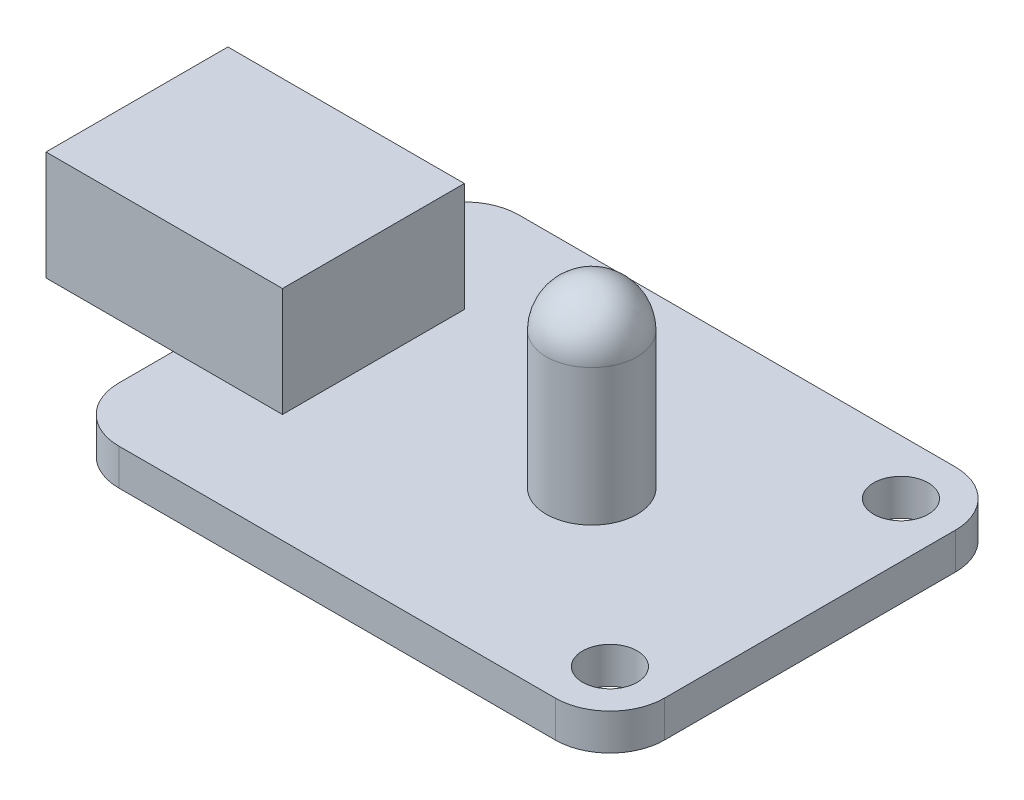
ISO-10303-21;
HEADER;
FILE_DESCRIPTION(('STEP AP214'),'2;1');
FILE_NAME('part.step','',(''),(''),'','','');
FILE_SCHEMA(('AUTOMOTIVE_DESIGN { 1 0 10303 214 1 1 1 1 }'));
ENDSEC;
DATA;
#1=APPLICATION_CONTEXT('core data for automotive mechanical design processes');
#2=APPLICATION_PROTOCOL_DEFINITION('international standard','automotive_design',2000,#1);
#3=PRODUCT_CONTEXT('',#1,'mechanical');
#4=PRODUCT('Part','Part','',(#3));
#5=PRODUCT_RELATED_PRODUCT_CATEGORY('part','',(#4));
#6=PRODUCT_DEFINITION_FORMATION('','',#4);
#7=PRODUCT_DEFINITION_CONTEXT('part definition',#1,'design');
#8=PRODUCT_DEFINITION('design','',#6,#7);
#9=PRODUCT_DEFINITION_SHAPE('','',#8);
#10=(LENGTH_UNIT() NAMED_UNIT(*) SI_UNIT(.MILLI.,.METRE.));
#11=(NAMED_UNIT(*) PLANE_ANGLE_UNIT() SI_UNIT($,.RADIAN.));
#12=(NAMED_UNIT(*) SI_UNIT($,.STERADIAN.) SOLID_ANGLE_UNIT());
#13=UNCERTAINTY_MEASURE_WITH_UNIT(LENGTH_MEASURE(1.E-05),#10,'distance_accuracy_value','');
#14=(GEOMETRIC_REPRESENTATION_CONTEXT(3) GLOBAL_UNCERTAINTY_ASSIGNED_CONTEXT((#13)) GLOBAL_UNIT_ASSIGNED_CONTEXT((#10,
#11,#12)) REPRESENTATION_CONTEXT('',''));
#15=CARTESIAN_POINT('',(0.,0.,0.));
#16=DIRECTION('',(0.,0.,1.));
#17=DIRECTION('',(1.,0.,0.));
#18=AXIS2_PLACEMENT_3D('',#15,#16,#17);
#19=CARTESIAN_POINT('',(12.,2.,-8.));
#20=DIRECTION('',(0.,1.,0.));
#21=DIRECTION('',(0.,0.,1.));
#22=AXIS2_PLACEMENT_3D('',#19,#20,#21);
#23=PLANE('',#22);
#24=CARTESIAN_POINT('',(3.,2.,0.));
#25=DIRECTION('',(0.,1.,0.));
#26=DIRECTION('',(0.,0.,1.));
#27=AXIS2_PLACEMENT_3D('',#24,#25,#26);
#28=CIRCLE('',#27,2.5);
#29=CARTESIAN_POINT('',(3.,2.,2.5));
#30=VERTEX_POINT('',#29);
#31=EDGE_CURVE('E242',#30,#30,#28,.T.);
#32=ORIENTED_EDGE('',*,*,#31,.F.);
#33=EDGE_LOOP('',(#32));
#34=FACE_BOUND('',#33,.T.);
#35=DIRECTION('',(1.,0.,0.));
#36=VECTOR('',#35,1.);
#37=CARTESIAN_POINT('',(-22.,2.,5.));
#38=LINE('',#37,#36);
#39=CARTESIAN_POINT('',(-15.,2.,5.));
#40=VERTEX_POINT('',#39);
#41=CARTESIAN_POINT('',(-9.00000000000001,2.,5.));
#42=VERTEX_POINT('',#41);
#43=EDGE_CURVE('E43',#40,#42,#38,.T.);
#44=ORIENTED_EDGE('',*,*,#43,.F.);
#45=DIRECTION('',(0.,0.,1.));
#46=VECTOR('',#45,1.);
#47=CARTESIAN_POINT('',(-15.,2.,-7.99999999999998));
#48=LINE('',#47,#46);
#49=CARTESIAN_POINT('',(-15.,2.,7.99999999999998));
#50=VERTEX_POINT('',#49);
#51=EDGE_CURVE('E176',#40,#50,#48,.T.);
#52=ORIENTED_EDGE('',*,*,#51,.T.);
#53=CARTESIAN_POINT('',(-12.,2.,8.));
#54=DIRECTION('',(0.,1.,0.));
#55=DIRECTION('',(0.,0.,1.));
#56=AXIS2_PLACEMENT_3D('',#53,#54,#55);
#57=CIRCLE('',#56,3.);
#58=CARTESIAN_POINT('',(-12.,2.,11.));
#59=VERTEX_POINT('',#58);
#60=EDGE_CURVE('E179',#50,#59,#57,.T.);
#61=ORIENTED_EDGE('',*,*,#60,.T.);
#62=DIRECTION('',(1.,0.,0.));
#63=VECTOR('',#62,1.);
#64=CARTESIAN_POINT('',(-12.,2.,11.));
#65=LINE('',#64,#63);
#66=CARTESIAN_POINT('',(12.,2.,11.));
#67=VERTEX_POINT('',#66);
#68=EDGE_CURVE('E182',#59,#67,#65,.T.);
#69=ORIENTED_EDGE('',*,*,#68,.T.);
#70=CARTESIAN_POINT('',(12.,2.,8.));
#71=DIRECTION('',(0.,1.,0.));
#72=DIRECTION('',(0.,0.,-1.));
#73=AXIS2_PLACEMENT_3D('',#70,#71,#72);
#74=CIRCLE('',#73,3.);
#75=CARTESIAN_POINT('',(15.,2.,7.99999999999998));
#76=VERTEX_POINT('',#75);
#77=EDGE_CURVE('E184',#67,#76,#74,.T.);
#78=ORIENTED_EDGE('',*,*,#77,.T.);
#79=DIRECTION('',(0.,0.,-1.));
#80=VECTOR('',#79,1.);
#81=CARTESIAN_POINT('',(15.,2.,-7.99999999999998));
#82=LINE('',#81,#80);
#83=CARTESIAN_POINT('',(15.,2.,-7.99999999999998));
#84=VERTEX_POINT('',#83);
#85=EDGE_CURVE('E186',#76,#84,#82,.T.);
#86=ORIENTED_EDGE('',*,*,#85,.T.);
#87=CARTESIAN_POINT('',(12.,2.,-8.));
#88=DIRECTION('',(0.,1.,0.));
#89=DIRECTION('',(0.,0.,1.));
#90=AXIS2_PLACEMENT_3D('',#87,#88,#89);
#91=CIRCLE('',#90,3.);
#92=CARTESIAN_POINT('',(12.,2.,-11.));
#93=VERTEX_POINT('',#92);
#94=EDGE_CURVE('E168',#84,#93,#91,.T.);
#95=ORIENTED_EDGE('',*,*,#94,.T.);
#96=DIRECTION('',(-1.,0.,0.));
#97=VECTOR('',#96,1.);
#98=CARTESIAN_POINT('',(-12.,2.,-11.));
#99=LINE('',#98,#97);
#100=CARTESIAN_POINT('',(-12.,2.,-11.));
#101=VERTEX_POINT('',#100);
#102=EDGE_CURVE('E171',#93,#101,#99,.T.);
#103=ORIENTED_EDGE('',*,*,#102,.T.);
#104=CARTESIAN_POINT('',(-12.,2.,-8.));
#105=DIRECTION('',(0.,1.,0.));
#106=DIRECTION('',(0.,0.,-1.));
#107=AXIS2_PLACEMENT_3D('',#104,#105,#106);
#108=CIRCLE('',#107,3.);
#109=CARTESIAN_POINT('',(-15.,2.,-7.99999999999998));
#110=VERTEX_POINT('',#109);
#111=EDGE_CURVE('E174',#101,#110,#108,.T.);
#112=ORIENTED_EDGE('',*,*,#111,.T.);
#113=CARTESIAN_POINT('',(-15.,2.,-5.));
#114=VERTEX_POINT('',#113);
#115=EDGE_CURVE('E177',#110,#114,#48,.T.);
#116=ORIENTED_EDGE('',*,*,#115,.T.);
#117=DIRECTION('',(-1.,0.,0.));
#118=VECTOR('',#117,1.);
#119=CARTESIAN_POINT('',(-22.,2.,-5.));
#120=LINE('',#119,#118);
#121=CARTESIAN_POINT('',(-9.00000000000001,2.,-5.));
#122=VERTEX_POINT('',#121);
#123=EDGE_CURVE('E55',#122,#114,#120,.T.);
#124=ORIENTED_EDGE('',*,*,#123,.F.);
#125=DIRECTION('',(0.,0.,-1.));
#126=VECTOR('',#125,1.);
#127=CARTESIAN_POINT('',(-9.00000000000001,2.,-5.));
#128=LINE('',#127,#126);
#129=EDGE_CURVE('E50',#42,#122,#128,.T.);
#130=ORIENTED_EDGE('',*,*,#129,.F.);
#131=EDGE_LOOP('',(#44,#52,#61,#69,#78,#86,#95,#103,#112,#116,#124,#130));
#132=FACE_BOUND('',#131,.T.);
#133=CARTESIAN_POINT('',(12.,2.,-8.));
#134=DIRECTION('',(0.,1.,0.));
#135=DIRECTION('',(0.,0.,1.));
#136=AXIS2_PLACEMENT_3D('',#133,#134,#135);
#137=CIRCLE('',#136,1.5);
#138=CARTESIAN_POINT('',(12.,2.,-6.5));
#139=VERTEX_POINT('',#138);
#140=EDGE_CURVE('E162',#139,#139,#137,.T.);
#141=ORIENTED_EDGE('',*,*,#140,.F.);
#142=EDGE_LOOP('',(#141));
#143=FACE_BOUND('',#142,.T.);
#144=CARTESIAN_POINT('',(12.,2.,8.));
#145=DIRECTION('',(0.,1.,0.));
#146=DIRECTION('',(0.,0.,1.));
#147=AXIS2_PLACEMENT_3D('',#144,#145,#146);
#148=CIRCLE('',#147,1.5);
#149=CARTESIAN_POINT('',(12.,2.,9.5));
#150=VERTEX_POINT('',#149);
#151=EDGE_CURVE('E153',#150,#150,#148,.T.);
#152=ORIENTED_EDGE('',*,*,#151,.F.);
#153=EDGE_LOOP('',(#152));
#154=FACE_BOUND('',#153,.T.);
#155=ADVANCED_FACE('F35',(#34,#132,#143,#154),#23,.T.);
#156=CARTESIAN_POINT('',(12.,0.,-8.));
#157=DIRECTION('',(0.,1.,0.));
#158=DIRECTION('',(0.,0.,1.));
#159=AXIS2_PLACEMENT_3D('',#156,#157,#158);
#160=PLANE('',#159);
#161=CARTESIAN_POINT('',(12.,0.,-8.));
#162=DIRECTION('',(0.,1.,0.));
#163=DIRECTION('',(0.,0.,1.));
#164=AXIS2_PLACEMENT_3D('',#161,#162,#163);
#165=CIRCLE('',#164,3.);
#166=CARTESIAN_POINT('',(15.,0.,-7.99999999999998));
#167=VERTEX_POINT('',#166);
#168=CARTESIAN_POINT('',(12.,0.,-11.));
#169=VERTEX_POINT('',#168);
#170=EDGE_CURVE('E165',#167,#169,#165,.T.);
#171=ORIENTED_EDGE('',*,*,#170,.F.);
#172=DIRECTION('',(0.,0.,-1.));
#173=VECTOR('',#172,1.);
#174=CARTESIAN_POINT('',(15.,0.,-7.99999999999998));
#175=LINE('',#174,#173);
#176=CARTESIAN_POINT('',(15.,0.,7.99999999999998));
#177=VERTEX_POINT('',#176);
#178=EDGE_CURVE('E172',#177,#167,#175,.T.);
#179=ORIENTED_EDGE('',*,*,#178,.F.);
#180=CARTESIAN_POINT('',(12.,0.,8.));
#181=DIRECTION('',(0.,1.,0.));
#182=DIRECTION('',(0.,0.,-1.));
#183=AXIS2_PLACEMENT_3D('',#180,#181,#182);
#184=CIRCLE('',#183,3.);
#185=CARTESIAN_POINT('',(12.,0.,11.));
#186=VERTEX_POINT('',#185);
#187=EDGE_CURVE('E201',#186,#177,#184,.T.);
#188=ORIENTED_EDGE('',*,*,#187,.F.);
#189=DIRECTION('',(1.,0.,0.));
#190=VECTOR('',#189,1.);
#191=CARTESIAN_POINT('',(-12.,0.,11.));
#192=LINE('',#191,#190);
#193=CARTESIAN_POINT('',(-12.,0.,11.));
#194=VERTEX_POINT('',#193);
#195=EDGE_CURVE('E199',#194,#186,#192,.T.);
#196=ORIENTED_EDGE('',*,*,#195,.F.);
#197=CARTESIAN_POINT('',(-12.,0.,8.));
#198=DIRECTION('',(0.,1.,0.));
#199=DIRECTION('',(0.,0.,1.));
#200=AXIS2_PLACEMENT_3D('',#197,#198,#199);
#201=CIRCLE('',#200,3.);
#202=CARTESIAN_POINT('',(-15.,0.,7.99999999999998));
#203=VERTEX_POINT('',#202);
#204=EDGE_CURVE('E197',#203,#194,#201,.T.);
#205=ORIENTED_EDGE('',*,*,#204,.F.);
#206=DIRECTION('',(0.,0.,1.));
#207=VECTOR('',#206,1.);
#208=CARTESIAN_POINT('',(-15.,0.,-7.99999999999998));
#209=LINE('',#208,#207);
#210=CARTESIAN_POINT('',(-15.,0.,-7.99999999999998));
#211=VERTEX_POINT('',#210);
#212=EDGE_CURVE('E195',#211,#203,#209,.T.);
#213=ORIENTED_EDGE('',*,*,#212,.F.);
#214=CARTESIAN_POINT('',(-12.,0.,-8.));
#215=DIRECTION('',(0.,1.,0.));
#216=DIRECTION('',(0.,0.,-1.));
#217=AXIS2_PLACEMENT_3D('',#214,#215,#216);
#218=CIRCLE('',#217,3.);
#219=CARTESIAN_POINT('',(-12.,0.,-11.));
#220=VERTEX_POINT('',#219);
#221=EDGE_CURVE('E193',#220,#211,#218,.T.);
#222=ORIENTED_EDGE('',*,*,#221,.F.);
#223=DIRECTION('',(-1.,0.,0.));
#224=VECTOR('',#223,1.);
#225=CARTESIAN_POINT('',(-12.,0.,-11.));
#226=LINE('',#225,#224);
#227=EDGE_CURVE('E191',#169,#220,#226,.T.);
#228=ORIENTED_EDGE('',*,*,#227,.F.);
#229=EDGE_LOOP('',(#171,#179,#188,#196,#205,#213,#222,#228));
#230=FACE_BOUND('',#229,.T.);
#231=CARTESIAN_POINT('',(12.,0.,-8.));
#232=DIRECTION('',(0.,1.,0.));
#233=DIRECTION('',(0.,0.,1.));
#234=AXIS2_PLACEMENT_3D('',#231,#232,#233);
#235=CIRCLE('',#234,1.5);
#236=CARTESIAN_POINT('',(12.,0.,-6.5));
#237=VERTEX_POINT('',#236);
#238=EDGE_CURVE('E160',#237,#237,#235,.T.);
#239=ORIENTED_EDGE('',*,*,#238,.T.);
#240=EDGE_LOOP('',(#239));
#241=FACE_BOUND('',#240,.T.);
#242=CARTESIAN_POINT('',(12.,0.,8.));
#243=DIRECTION('',(0.,1.,0.));
#244=DIRECTION('',(0.,0.,1.));
#245=AXIS2_PLACEMENT_3D('',#242,#243,#244);
#246=CIRCLE('',#245,1.5);
#247=CARTESIAN_POINT('',(12.,0.,9.5));
#248=VERTEX_POINT('',#247);
#249=EDGE_CURVE('E150',#248,#248,#246,.T.);
#250=ORIENTED_EDGE('',*,*,#249,.T.);
#251=EDGE_LOOP('',(#250));
#252=FACE_BOUND('',#251,.T.);
#253=ADVANCED_FACE('F252',(#230,#241,#252),#160,.F.);
#254=CARTESIAN_POINT('',(12.,2.,-8.));
#255=DIRECTION('',(0.,-1.,0.));
#256=DIRECTION('',(0.,0.,-1.));
#257=AXIS2_PLACEMENT_3D('',#254,#255,#256);
#258=CYLINDRICAL_SURFACE('',#257,3.);
#259=ORIENTED_EDGE('',*,*,#170,.T.);
#260=DIRECTION('',(0.,-1.,0.));
#261=VECTOR('',#260,1.);
#262=CARTESIAN_POINT('',(12.,2.,-11.));
#263=LINE('',#262,#261);
#264=EDGE_CURVE('E223',#93,#169,#263,.T.);
#265=ORIENTED_EDGE('',*,*,#264,.F.);
#266=ORIENTED_EDGE('',*,*,#94,.F.);
#267=DIRECTION('',(0.,-1.,0.));
#268=VECTOR('',#267,1.);
#269=CARTESIAN_POINT('',(15.,2.,-7.99999999999998));
#270=LINE('',#269,#268);
#271=EDGE_CURVE('E188',#84,#167,#270,.T.);
#272=ORIENTED_EDGE('',*,*,#271,.T.);
#273=EDGE_LOOP('',(#259,#265,#266,#272));
#274=FACE_BOUND('',#273,.T.);
#275=ADVANCED_FACE('F269',(#274),#258,.T.);
#276=CARTESIAN_POINT('',(-12.,2.,-11.));
#277=DIRECTION('',(0.,0.,1.));
#278=DIRECTION('',(1.,0.,0.));
#279=AXIS2_PLACEMENT_3D('',#276,#277,#278);
#280=PLANE('',#279);
#281=ORIENTED_EDGE('',*,*,#227,.T.);
#282=DIRECTION('',(0.,-1.,0.));
#283=VECTOR('',#282,1.);
#284=CARTESIAN_POINT('',(-12.,2.,-11.));
#285=LINE('',#284,#283);
#286=EDGE_CURVE('E221',#101,#220,#285,.T.);
#287=ORIENTED_EDGE('',*,*,#286,.F.);
#288=ORIENTED_EDGE('',*,*,#102,.F.);
#289=ORIENTED_EDGE('',*,*,#264,.T.);
#290=EDGE_LOOP('',(#281,#287,#288,#289));
#291=FACE_BOUND('',#290,.T.);
#292=ADVANCED_FACE('F276',(#291),#280,.F.);
#293=CARTESIAN_POINT('',(-12.,2.,-8.));
#294=DIRECTION('',(0.,-1.,0.));
#295=DIRECTION('',(0.,0.,-1.));
#296=AXIS2_PLACEMENT_3D('',#293,#294,#295);
#297=CYLINDRICAL_SURFACE('',#296,3.);
#298=ORIENTED_EDGE('',*,*,#221,.T.);
#299=DIRECTION('',(0.,-1.,0.));
#300=VECTOR('',#299,1.);
#301=CARTESIAN_POINT('',(-15.,2.,-7.99999999999998));
#302=LINE('',#301,#300);
#303=EDGE_CURVE('E218',#110,#211,#302,.T.);
#304=ORIENTED_EDGE('',*,*,#303,.F.);
#305=ORIENTED_EDGE('',*,*,#111,.F.);
#306=ORIENTED_EDGE('',*,*,#286,.T.);
#307=EDGE_LOOP('',(#298,#304,#305,#306));
#308=FACE_BOUND('',#307,.T.);
#309=ADVANCED_FACE('F301',(#308),#297,.T.);
#310=CARTESIAN_POINT('',(-15.,2.,-7.99999999999998));
#311=DIRECTION('',(1.,0.,0.));
#312=DIRECTION('',(0.,0.,-1.));
#313=AXIS2_PLACEMENT_3D('',#310,#311,#312);
#314=PLANE('',#313);
#315=ORIENTED_EDGE('',*,*,#212,.T.);
#316=DIRECTION('',(0.,-1.,0.));
#317=VECTOR('',#316,1.);
#318=CARTESIAN_POINT('',(-15.,2.,7.99999999999998));
#319=LINE('',#318,#317);
#320=EDGE_CURVE('E215',#50,#203,#319,.T.);
#321=ORIENTED_EDGE('',*,*,#320,.F.);
#322=ORIENTED_EDGE('',*,*,#51,.F.);
#323=EDGE_CURVE('E180',#114,#40,#48,.T.);
#324=ORIENTED_EDGE('',*,*,#323,.F.);
#325=ORIENTED_EDGE('',*,*,#115,.F.);
#326=ORIENTED_EDGE('',*,*,#303,.T.);
#327=EDGE_LOOP('',(#315,#321,#322,#324,#325,#326));
#328=FACE_BOUND('',#327,.T.);
#329=ADVANCED_FACE('F297',(#328),#314,.F.);
#330=CARTESIAN_POINT('',(-12.,2.,8.));
#331=DIRECTION('',(0.,-1.,0.));
#332=DIRECTION('',(0.,0.,-1.));
#333=AXIS2_PLACEMENT_3D('',#330,#331,#332);
#334=CYLINDRICAL_SURFACE('',#333,3.);
#335=ORIENTED_EDGE('',*,*,#204,.T.);
#336=DIRECTION('',(0.,-1.,0.));
#337=VECTOR('',#336,1.);
#338=CARTESIAN_POINT('',(-12.,2.,11.));
#339=LINE('',#338,#337);
#340=EDGE_CURVE('E212',#59,#194,#339,.T.);
#341=ORIENTED_EDGE('',*,*,#340,.F.);
#342=ORIENTED_EDGE('',*,*,#60,.F.);
#343=ORIENTED_EDGE('',*,*,#320,.T.);
#344=EDGE_LOOP('',(#335,#341,#342,#343));
#345=FACE_BOUND('',#344,.T.);
#346=ADVANCED_FACE('F293',(#345),#334,.T.);
#347=CARTESIAN_POINT('',(-12.,2.,11.));
#348=DIRECTION('',(0.,0.,-1.));
#349=DIRECTION('',(-1.,0.,0.));
#350=AXIS2_PLACEMENT_3D('',#347,#348,#349);
#351=PLANE('',#350);
#352=ORIENTED_EDGE('',*,*,#195,.T.);
#353=DIRECTION('',(0.,-1.,0.));
#354=VECTOR('',#353,1.);
#355=CARTESIAN_POINT('',(12.,2.,11.));
#356=LINE('',#355,#354);
#357=EDGE_CURVE('E209',#67,#186,#356,.T.);
#358=ORIENTED_EDGE('',*,*,#357,.F.);
#359=ORIENTED_EDGE('',*,*,#68,.F.);
#360=ORIENTED_EDGE('',*,*,#340,.T.);
#361=EDGE_LOOP('',(#352,#358,#359,#360));
#362=FACE_BOUND('',#361,.T.);
#363=ADVANCED_FACE('F289',(#362),#351,.F.);
#364=CARTESIAN_POINT('',(12.,2.,8.));
#365=DIRECTION('',(0.,-1.,0.));
#366=DIRECTION('',(0.,0.,-1.));
#367=AXIS2_PLACEMENT_3D('',#364,#365,#366);
#368=CYLINDRICAL_SURFACE('',#367,3.);
#369=ORIENTED_EDGE('',*,*,#187,.T.);
#370=DIRECTION('',(0.,-1.,0.));
#371=VECTOR('',#370,1.);
#372=CARTESIAN_POINT('',(15.,2.,7.99999999999998));
#373=LINE('',#372,#371);
#374=EDGE_CURVE('E206',#76,#177,#373,.T.);
#375=ORIENTED_EDGE('',*,*,#374,.F.);
#376=ORIENTED_EDGE('',*,*,#77,.F.);
#377=ORIENTED_EDGE('',*,*,#357,.T.);
#378=EDGE_LOOP('',(#369,#375,#376,#377));
#379=FACE_BOUND('',#378,.T.);
#380=ADVANCED_FACE('F285',(#379),#368,.T.);
#381=CARTESIAN_POINT('',(15.,2.,-7.99999999999998));
#382=DIRECTION('',(-1.,0.,0.));
#383=DIRECTION('',(0.,0.,1.));
#384=AXIS2_PLACEMENT_3D('',#381,#382,#383);
#385=PLANE('',#384);
#386=ORIENTED_EDGE('',*,*,#178,.T.);
#387=ORIENTED_EDGE('',*,*,#271,.F.);
#388=ORIENTED_EDGE('',*,*,#85,.F.);
#389=ORIENTED_EDGE('',*,*,#374,.T.);
#390=EDGE_LOOP('',(#386,#387,#388,#389));
#391=FACE_BOUND('',#390,.T.);
#392=ADVANCED_FACE('F282',(#391),#385,.F.);
#393=CARTESIAN_POINT('',(12.,2.,-8.));
#394=DIRECTION('',(0.,-1.,0.));
#395=DIRECTION('',(0.,0.,-1.));
#396=AXIS2_PLACEMENT_3D('',#393,#394,#395);
#397=CYLINDRICAL_SURFACE('',#396,1.5);
#398=ORIENTED_EDGE('',*,*,#140,.T.);
#399=EDGE_LOOP('',(#398));
#400=FACE_BOUND('',#399,.T.);
#401=ORIENTED_EDGE('',*,*,#238,.F.);
#402=EDGE_LOOP('',(#401));
#403=FACE_BOUND('',#402,.T.);
#404=ADVANCED_FACE('F264',(#400,#403),#397,.F.);
#405=CARTESIAN_POINT('',(12.,2.,8.));
#406=DIRECTION('',(0.,-1.,0.));
#407=DIRECTION('',(0.,0.,-1.));
#408=AXIS2_PLACEMENT_3D('',#405,#406,#407);
#409=CYLINDRICAL_SURFACE('',#408,1.5);
#410=ORIENTED_EDGE('',*,*,#151,.T.);
#411=EDGE_LOOP('',(#410));
#412=FACE_BOUND('',#411,.T.);
#413=ORIENTED_EDGE('',*,*,#249,.F.);
#414=EDGE_LOOP('',(#413));
#415=FACE_BOUND('',#414,.T.);
#416=ADVANCED_FACE('F260',(#412,#415),#409,.F.);
#417=CARTESIAN_POINT('',(0.,2.,0.));
#418=DIRECTION('',(0.,1.,0.));
#419=DIRECTION('',(0.,0.,1.));
#420=AXIS2_PLACEMENT_3D('',#417,#418,#419);
#421=PLANE('',#420);
#422=CARTESIAN_POINT('',(-22.,2.,-5.));
#423=VERTEX_POINT('',#422);
#424=EDGE_CURVE('E238',#114,#423,#120,.T.);
#425=ORIENTED_EDGE('',*,*,#424,.F.);
#426=ORIENTED_EDGE('',*,*,#323,.T.);
#427=CARTESIAN_POINT('',(-22.,2.,5.));
#428=VERTEX_POINT('',#427);
#429=EDGE_CURVE('E147',#428,#40,#38,.T.);
#430=ORIENTED_EDGE('',*,*,#429,.F.);
#431=DIRECTION('',(0.,0.,1.));
#432=VECTOR('',#431,1.);
#433=CARTESIAN_POINT('',(-22.,2.,-5.));
#434=LINE('',#433,#432);
#435=EDGE_CURVE('E232',#423,#428,#434,.T.);
#436=ORIENTED_EDGE('',*,*,#435,.F.);
#437=EDGE_LOOP('',(#425,#426,#430,#436));
#438=FACE_BOUND('',#437,.T.);
#439=ADVANCED_FACE('F263',(#438),#421,.F.);
#440=CARTESIAN_POINT('',(-9.00000000000001,8.,-5.));
#441=DIRECTION('',(-1.,0.,0.));
#442=DIRECTION('',(0.,0.,1.));
#443=AXIS2_PLACEMENT_3D('',#440,#441,#442);
#444=PLANE('',#443);
#445=ORIENTED_EDGE('',*,*,#129,.T.);
#446=DIRECTION('',(0.,-1.,0.));
#447=VECTOR('',#446,1.);
#448=CARTESIAN_POINT('',(-9.00000000000001,8.,-5.));
#449=LINE('',#448,#447);
#450=CARTESIAN_POINT('',(-9.00000000000001,8.,-5.));
#451=VERTEX_POINT('',#450);
#452=EDGE_CURVE('E132',#451,#122,#449,.T.);
#453=ORIENTED_EDGE('',*,*,#452,.F.);
#454=DIRECTION('',(0.,0.,-1.));
#455=VECTOR('',#454,1.);
#456=CARTESIAN_POINT('',(-9.00000000000001,8.,-5.));
#457=LINE('',#456,#455);
#458=CARTESIAN_POINT('',(-9.00000000000001,8.,5.));
#459=VERTEX_POINT('',#458);
#460=EDGE_CURVE('E138',#459,#451,#457,.T.);
#461=ORIENTED_EDGE('',*,*,#460,.F.);
#462=DIRECTION('',(0.,-1.,0.));
#463=VECTOR('',#462,1.);
#464=CARTESIAN_POINT('',(-9.00000000000001,8.,5.));
#465=LINE('',#464,#463);
#466=EDGE_CURVE('E244',#459,#42,#465,.T.);
#467=ORIENTED_EDGE('',*,*,#466,.T.);
#468=EDGE_LOOP('',(#445,#453,#461,#467));
#469=FACE_BOUND('',#468,.T.);
#470=ADVANCED_FACE('F149',(#469),#444,.F.);
#471=CARTESIAN_POINT('',(-22.,8.,-5.));
#472=DIRECTION('',(0.,0.,1.));
#473=DIRECTION('',(1.,0.,0.));
#474=AXIS2_PLACEMENT_3D('',#471,#472,#473);
#475=PLANE('',#474);
#476=ORIENTED_EDGE('',*,*,#123,.T.);
#477=ORIENTED_EDGE('',*,*,#424,.T.);
#478=DIRECTION('',(0.,-1.,0.));
#479=VECTOR('',#478,1.);
#480=CARTESIAN_POINT('',(-22.,8.,-5.));
#481=LINE('',#480,#479);
#482=CARTESIAN_POINT('',(-22.,8.,-5.));
#483=VERTEX_POINT('',#482);
#484=EDGE_CURVE('E134',#483,#423,#481,.T.);
#485=ORIENTED_EDGE('',*,*,#484,.F.);
#486=DIRECTION('',(-1.,0.,0.));
#487=VECTOR('',#486,1.);
#488=CARTESIAN_POINT('',(-22.,8.,-5.));
#489=LINE('',#488,#487);
#490=EDGE_CURVE('E128',#451,#483,#489,.T.);
#491=ORIENTED_EDGE('',*,*,#490,.F.);
#492=ORIENTED_EDGE('',*,*,#452,.T.);
#493=EDGE_LOOP('',(#476,#477,#485,#491,#492));
#494=FACE_BOUND('',#493,.T.);
#495=ADVANCED_FACE('F130',(#494),#475,.F.);
#496=CARTESIAN_POINT('',(-22.,8.,-5.));
#497=DIRECTION('',(1.,0.,0.));
#498=DIRECTION('',(0.,0.,-1.));
#499=AXIS2_PLACEMENT_3D('',#496,#497,#498);
#500=PLANE('',#499);
#501=ORIENTED_EDGE('',*,*,#435,.T.);
#502=DIRECTION('',(0.,-1.,0.));
#503=VECTOR('',#502,1.);
#504=CARTESIAN_POINT('',(-22.,8.,5.));
#505=LINE('',#504,#503);
#506=CARTESIAN_POINT('',(-22.,8.,5.));
#507=VERTEX_POINT('',#506);
#508=EDGE_CURVE('E155',#507,#428,#505,.T.);
#509=ORIENTED_EDGE('',*,*,#508,.F.);
#510=DIRECTION('',(0.,0.,1.));
#511=VECTOR('',#510,1.);
#512=CARTESIAN_POINT('',(-22.,8.,-5.));
#513=LINE('',#512,#511);
#514=EDGE_CURVE('E137',#483,#507,#513,.T.);
#515=ORIENTED_EDGE('',*,*,#514,.F.);
#516=ORIENTED_EDGE('',*,*,#484,.T.);
#517=EDGE_LOOP('',(#501,#509,#515,#516));
#518=FACE_BOUND('',#517,.T.);
#519=ADVANCED_FACE('F333',(#518),#500,.F.);
#520=CARTESIAN_POINT('',(-22.,8.,5.));
#521=DIRECTION('',(0.,0.,-1.));
#522=DIRECTION('',(-1.,0.,0.));
#523=AXIS2_PLACEMENT_3D('',#520,#521,#522);
#524=PLANE('',#523);
#525=ORIENTED_EDGE('',*,*,#429,.T.);
#526=ORIENTED_EDGE('',*,*,#43,.T.);
#527=ORIENTED_EDGE('',*,*,#466,.F.);
#528=DIRECTION('',(1.,0.,0.));
#529=VECTOR('',#528,1.);
#530=CARTESIAN_POINT('',(-22.,8.,5.));
#531=LINE('',#530,#529);
#532=EDGE_CURVE('E143',#507,#459,#531,.T.);
#533=ORIENTED_EDGE('',*,*,#532,.F.);
#534=ORIENTED_EDGE('',*,*,#508,.T.);
#535=EDGE_LOOP('',(#525,#526,#527,#533,#534));
#536=FACE_BOUND('',#535,.T.);
#537=ADVANCED_FACE('F334',(#536),#524,.F.);
#538=CARTESIAN_POINT('',(0.,8.,0.));
#539=DIRECTION('',(0.,1.,0.));
#540=DIRECTION('',(0.,0.,1.));
#541=AXIS2_PLACEMENT_3D('',#538,#539,#540);
#542=PLANE('',#541);
#543=ORIENTED_EDGE('',*,*,#460,.T.);
#544=ORIENTED_EDGE('',*,*,#490,.T.);
#545=ORIENTED_EDGE('',*,*,#514,.T.);
#546=ORIENTED_EDGE('',*,*,#532,.T.);
#547=EDGE_LOOP('',(#543,#544,#545,#546));
#548=FACE_BOUND('',#547,.T.);
#549=ADVANCED_FACE('F141',(#548),#542,.T.);
#550=CARTESIAN_POINT('',(3.,12.,0.));
#551=DIRECTION('',(0.,-1.,0.));
#552=DIRECTION('',(0.,0.,-1.));
#553=AXIS2_PLACEMENT_3D('',#550,#551,#552);
#554=CYLINDRICAL_SURFACE('',#553,2.5);
#555=CARTESIAN_POINT('',(3.,9.5,0.));
#556=DIRECTION('',(0.,-1.,0.));
#557=DIRECTION('',(0.,0.,-1.));
#558=AXIS2_PLACEMENT_3D('',#555,#556,#557);
#559=CIRCLE('',#558,2.5);
#560=CARTESIAN_POINT('',(3.,9.5,-2.5));
#561=VERTEX_POINT('',#560);
#562=EDGE_CURVE('E11',#561,#561,#559,.T.);
#563=ORIENTED_EDGE('',*,*,#562,.T.);
#564=EDGE_LOOP('',(#563));
#565=FACE_BOUND('',#564,.T.);
#566=ORIENTED_EDGE('',*,*,#31,.T.);
#567=EDGE_LOOP('',(#566));
#568=FACE_BOUND('',#567,.T.);
#569=ADVANCED_FACE('F249',(#565,#568),#554,.T.);
#570=CARTESIAN_POINT('',(3.,9.5,0.));
#571=DIRECTION('',(0.,1.,0.));
#572=DIRECTION('',(0.,0.,1.));
#573=AXIS2_PLACEMENT_3D('',#570,#571,#572);
#574=SPHERICAL_SURFACE('',#573,2.5);
#575=ORIENTED_EDGE('',*,*,#562,.F.);
#576=EDGE_LOOP('',(#575));
#577=FACE_BOUND('',#576,.T.);
#578=ADVANCED_FACE('F37',(#577),#574,.T.);
#579=CLOSED_SHELL('',(#155,#253,#275,#292,#309,#329,#346,#363,#380,#392,#404,#416,#439,#470,
#495,#519,#537,#549,#569,#578));
#580=MANIFOLD_SOLID_BREP('B2',#579);
#581=ADVANCED_BREP_SHAPE_REPRESENTATION('',(#18,#580),#14);
#582=SHAPE_DEFINITION_REPRESENTATION(#9,#581);
ENDSEC;
END-ISO-10303-21;
